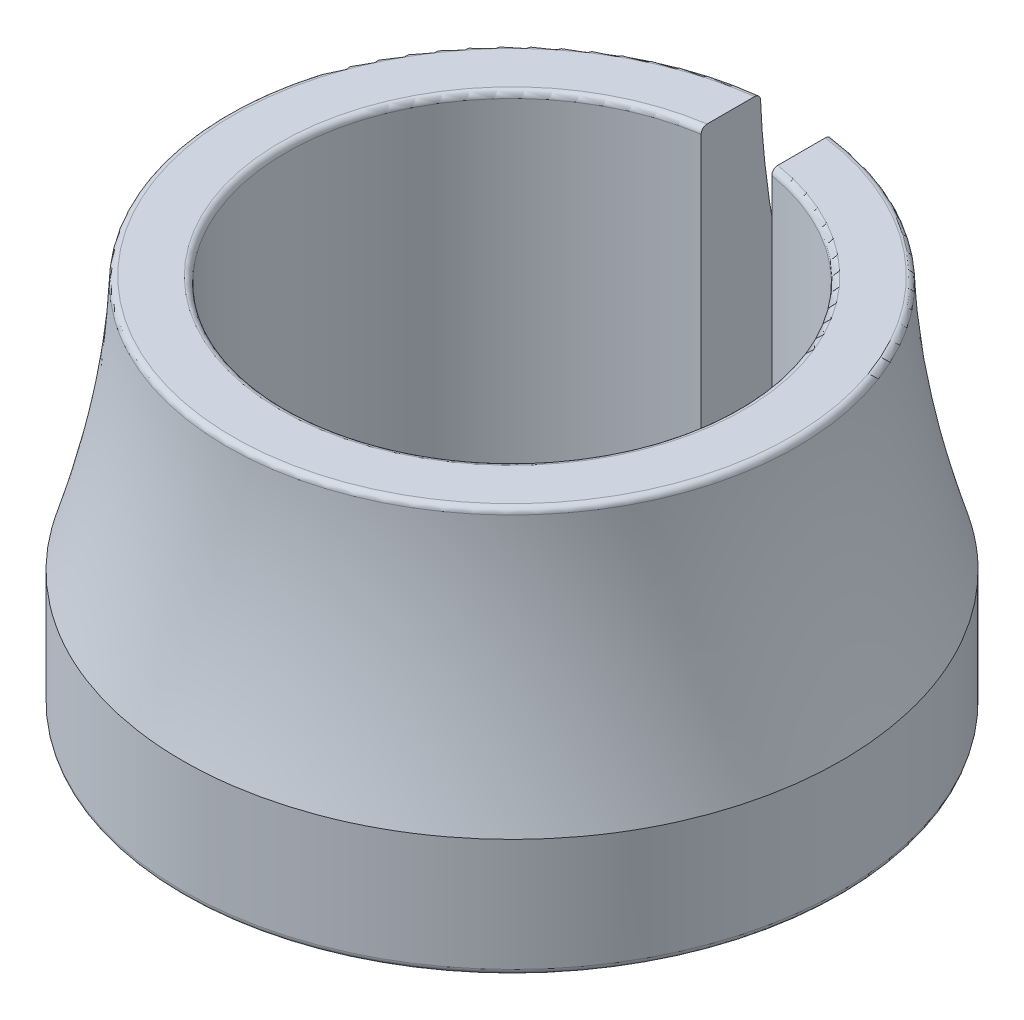
ISO-10303-21;
HEADER;
FILE_DESCRIPTION(('STEP AP214'),'2;1');
FILE_NAME('part.step','',(''),(''),'','','');
FILE_SCHEMA(('AUTOMOTIVE_DESIGN { 1 0 10303 214 1 1 1 1 }'));
ENDSEC;
DATA;
#1=APPLICATION_CONTEXT('core data for automotive mechanical design processes');
#2=APPLICATION_PROTOCOL_DEFINITION('international standard','automotive_design',2000,#1);
#3=PRODUCT_CONTEXT('',#1,'mechanical');
#4=PRODUCT('Part','Part','',(#3));
#5=PRODUCT_RELATED_PRODUCT_CATEGORY('part','',(#4));
#6=PRODUCT_DEFINITION_FORMATION('','',#4);
#7=PRODUCT_DEFINITION_CONTEXT('part definition',#1,'design');
#8=PRODUCT_DEFINITION('design','',#6,#7);
#9=PRODUCT_DEFINITION_SHAPE('','',#8);
#10=(LENGTH_UNIT() NAMED_UNIT(*) SI_UNIT(.MILLI.,.METRE.));
#11=(NAMED_UNIT(*) PLANE_ANGLE_UNIT() SI_UNIT($,.RADIAN.));
#12=(NAMED_UNIT(*) SI_UNIT($,.STERADIAN.) SOLID_ANGLE_UNIT());
#13=UNCERTAINTY_MEASURE_WITH_UNIT(LENGTH_MEASURE(1.E-05),#10,'distance_accuracy_value','');
#14=(GEOMETRIC_REPRESENTATION_CONTEXT(3) GLOBAL_UNCERTAINTY_ASSIGNED_CONTEXT((#13)) GLOBAL_UNIT_ASSIGNED_CONTEXT((#10,
#11,#12)) REPRESENTATION_CONTEXT('',''));
#15=CARTESIAN_POINT('',(0.,0.,0.));
#16=DIRECTION('',(0.,0.,1.));
#17=DIRECTION('',(1.,0.,0.));
#18=AXIS2_PLACEMENT_3D('',#15,#16,#17);
#19=CARTESIAN_POINT('',(0.,0.,0.));
#20=DIRECTION('',(0.,1.,0.));
#21=DIRECTION('',(0.,0.,1.));
#22=AXIS2_PLACEMENT_3D('',#19,#20,#21);
#23=PLANE('',#22);
#24=DIRECTION('',(0.,0.,1.));
#25=VECTOR('',#24,1.);
#26=CARTESIAN_POINT('',(-0.576429737181854,0.,0.));
#27=LINE('',#26,#25);
#28=CARTESIAN_POINT('',(-0.576429737181854,0.,-5.42948697006379));
#29=VERTEX_POINT('',#28);
#30=CARTESIAN_POINT('',(-0.576429737181854,0.,-3.86727665910941));
#31=VERTEX_POINT('',#30);
#32=EDGE_CURVE('E149',#29,#31,#27,.T.);
#33=ORIENTED_EDGE('',*,*,#32,.T.);
#34=CARTESIAN_POINT('',(0.,0.,0.));
#35=DIRECTION('',(0.,1.,0.));
#36=DIRECTION('',(0.,0.,1.));
#37=AXIS2_PLACEMENT_3D('',#34,#35,#36);
#38=CIRCLE('',#37,3.91);
#39=CARTESIAN_POINT('',(0.623570262818146,0.,-3.85995597479154));
#40=VERTEX_POINT('',#39);
#41=EDGE_CURVE('E250',#31,#40,#38,.T.);
#42=ORIENTED_EDGE('',*,*,#41,.T.);
#43=DIRECTION('',(0.,0.,-1.));
#44=VECTOR('',#43,1.);
#45=CARTESIAN_POINT('',(0.623570262818147,0.,0.));
#46=LINE('',#45,#44);
#47=CARTESIAN_POINT('',(0.623570262818146,0.,-5.42427507850855));
#48=VERTEX_POINT('',#47);
#49=EDGE_CURVE('E128',#40,#48,#46,.T.);
#50=ORIENTED_EDGE('',*,*,#49,.T.);
#51=CARTESIAN_POINT('',(0.,0.,0.));
#52=DIRECTION('',(0.,1.,0.));
#53=DIRECTION('',(0.,0.,1.));
#54=AXIS2_PLACEMENT_3D('',#51,#52,#53);
#55=CIRCLE('',#54,5.46);
#56=EDGE_CURVE('E272',#48,#29,#55,.F.);
#57=ORIENTED_EDGE('',*,*,#56,.T.);
#58=EDGE_LOOP('',(#33,#42,#50,#57));
#59=FACE_BOUND('',#58,.T.);
#60=ADVANCED_FACE('F43',(#59),#23,.F.);
#61=CARTESIAN_POINT('',(0.,2.,0.));
#62=DIRECTION('',(0.,-1.,0.));
#63=DIRECTION('',(0.,0.,-1.));
#64=AXIS2_PLACEMENT_3D('',#61,#62,#63);
#65=CYLINDRICAL_SURFACE('',#64,5.56);
#66=DIRECTION('',(0.,-1.,0.));
#67=VECTOR('',#66,1.);
#68=CARTESIAN_POINT('',(-0.576429737181854,2.,-5.53003876641859));
#69=LINE('',#68,#67);
#70=CARTESIAN_POINT('',(-0.576429737181854,2.,-5.53003876641859));
#71=VERTEX_POINT('',#70);
#72=CARTESIAN_POINT('',(-0.576429737181854,0.1,-5.53003876641859));
#73=VERTEX_POINT('',#72);
#74=EDGE_CURVE('E262',#71,#73,#69,.T.);
#75=ORIENTED_EDGE('',*,*,#74,.T.);
#76=CARTESIAN_POINT('',(0.,0.1,0.));
#77=DIRECTION('',(0.,1.,0.));
#78=DIRECTION('',(0.,0.,1.));
#79=AXIS2_PLACEMENT_3D('',#76,#77,#78);
#80=CIRCLE('',#79,5.56);
#81=CARTESIAN_POINT('',(0.623570262818146,0.1,-5.52492173042559));
#82=VERTEX_POINT('',#81);
#83=EDGE_CURVE('E125',#73,#82,#80,.T.);
#84=ORIENTED_EDGE('',*,*,#83,.T.);
#85=DIRECTION('',(0.,-1.,0.));
#86=VECTOR('',#85,1.);
#87=CARTESIAN_POINT('',(0.623570262818146,2.,-5.52492173042559));
#88=LINE('',#87,#86);
#89=CARTESIAN_POINT('',(0.623570262818146,2.,-5.52492173042559));
#90=VERTEX_POINT('',#89);
#91=EDGE_CURVE('E118',#82,#90,#88,.F.);
#92=ORIENTED_EDGE('',*,*,#91,.T.);
#93=CARTESIAN_POINT('',(0.,2.,0.));
#94=DIRECTION('',(0.,-1.,0.));
#95=DIRECTION('',(0.,0.,-1.));
#96=AXIS2_PLACEMENT_3D('',#93,#94,#95);
#97=CIRCLE('',#96,5.56);
#98=EDGE_CURVE('E123',#71,#90,#97,.F.);
#99=ORIENTED_EDGE('',*,*,#98,.F.);
#100=EDGE_LOOP('',(#75,#84,#92,#99));
#101=FACE_BOUND('',#100,.T.);
#102=ADVANCED_FACE('F121',(#101),#65,.T.);
#103=CARTESIAN_POINT('',(0.,2.,0.));
#104=DIRECTION('',(0.,-1.,0.));
#105=DIRECTION('',(0.,0.,-1.));
#106=AXIS2_PLACEMENT_3D('',#103,#104,#105);
#107=CYLINDRICAL_SURFACE('',#106,3.81);
#108=DIRECTION('',(0.,-1.,0.));
#109=VECTOR('',#108,1.);
#110=CARTESIAN_POINT('',(0.623570262818146,2.,-3.75862476543335));
#111=LINE('',#110,#109);
#112=CARTESIAN_POINT('',(0.623570262818146,0.1,-3.75862476543335));
#113=VERTEX_POINT('',#112);
#114=CARTESIAN_POINT('',(0.623570262818146,6.2,-3.75862476543335));
#115=VERTEX_POINT('',#114);
#116=EDGE_CURVE('E259',#113,#115,#111,.F.);
#117=ORIENTED_EDGE('',*,*,#116,.F.);
#118=CARTESIAN_POINT('',(0.,0.1,0.));
#119=DIRECTION('',(0.,1.,0.));
#120=DIRECTION('',(0.,0.,1.));
#121=AXIS2_PLACEMENT_3D('',#118,#119,#120);
#122=CIRCLE('',#121,3.81);
#123=CARTESIAN_POINT('',(-0.576429737181854,0.1,-3.76614242403185));
#124=VERTEX_POINT('',#123);
#125=EDGE_CURVE('E289',#113,#124,#122,.F.);
#126=ORIENTED_EDGE('',*,*,#125,.T.);
#127=DIRECTION('',(0.,-1.,0.));
#128=VECTOR('',#127,1.);
#129=CARTESIAN_POINT('',(-0.576429737181854,2.,-3.76614242403185));
#130=LINE('',#129,#128);
#131=CARTESIAN_POINT('',(-0.576429737181854,6.2,-3.76614242403185));
#132=VERTEX_POINT('',#131);
#133=EDGE_CURVE('E145',#132,#124,#130,.T.);
#134=ORIENTED_EDGE('',*,*,#133,.F.);
#135=CARTESIAN_POINT('',(0.,6.2,0.));
#136=DIRECTION('',(0.,1.,0.));
#137=DIRECTION('',(0.,0.,1.));
#138=AXIS2_PLACEMENT_3D('',#135,#136,#137);
#139=CIRCLE('',#138,3.81);
#140=EDGE_CURVE('E293',#132,#115,#139,.T.);
#141=ORIENTED_EDGE('',*,*,#140,.T.);
#142=EDGE_LOOP('',(#117,#126,#134,#141));
#143=FACE_BOUND('',#142,.T.);
#144=ADVANCED_FACE('F305',(#143),#107,.F.);
#145=CARTESIAN_POINT('',(0.,6.3,0.));
#146=DIRECTION('',(0.,1.,0.));
#147=DIRECTION('',(0.,0.,1.));
#148=AXIS2_PLACEMENT_3D('',#145,#146,#147);
#149=PLANE('',#148);
#150=DIRECTION('',(0.,0.,1.));
#151=VECTOR('',#150,1.);
#152=CARTESIAN_POINT('',(-0.576429737181854,6.3,-6.01133868775365));
#153=LINE('',#152,#151);
#154=CARTESIAN_POINT('',(-0.576429737181854,6.3,-4.66815093062153));
#155=VERTEX_POINT('',#154);
#156=CARTESIAN_POINT('',(-0.576429737181854,6.3,-3.86727665910941));
#157=VERTEX_POINT('',#156);
#158=EDGE_CURVE('E241',#155,#157,#153,.T.);
#159=ORIENTED_EDGE('',*,*,#158,.F.);
#160=CARTESIAN_POINT('',(0.,6.3,0.));
#161=DIRECTION('',(0.,1.,0.));
#162=DIRECTION('',(0.,0.,1.));
#163=AXIS2_PLACEMENT_3D('',#160,#161,#162);
#164=CIRCLE('',#163,4.70360546314954);
#165=CARTESIAN_POINT('',(0.623570262818146,6.3,-4.66208799576961));
#166=VERTEX_POINT('',#165);
#167=EDGE_CURVE('E53',#155,#166,#164,.T.);
#168=ORIENTED_EDGE('',*,*,#167,.T.);
#169=DIRECTION('',(0.,0.,-1.));
#170=VECTOR('',#169,1.);
#171=CARTESIAN_POINT('',(0.623570262818146,6.3,-6.01133868775365));
#172=LINE('',#171,#170);
#173=CARTESIAN_POINT('',(0.623570262818146,6.3,-3.85995597479154));
#174=VERTEX_POINT('',#173);
#175=EDGE_CURVE('E129',#174,#166,#172,.T.);
#176=ORIENTED_EDGE('',*,*,#175,.F.);
#177=CARTESIAN_POINT('',(0.,6.3,0.));
#178=DIRECTION('',(0.,1.,0.));
#179=DIRECTION('',(0.,0.,1.));
#180=AXIS2_PLACEMENT_3D('',#177,#178,#179);
#181=CIRCLE('',#180,3.91);
#182=EDGE_CURVE('E60',#174,#157,#181,.F.);
#183=ORIENTED_EDGE('',*,*,#182,.T.);
#184=EDGE_LOOP('',(#159,#168,#176,#183));
#185=FACE_BOUND('',#184,.T.);
#186=ADVANCED_FACE('F240',(#185),#149,.T.);
#187=CARTESIAN_POINT('',(-1.37594728698393,2.,5.38705569522365));
#188=CARTESIAN_POINT('',(-3.1855926788758,6.3,3.59054303473624));
#189=CARTESIAN_POINT('',(9.39816410346337,2.,8.1389502691915));
#190=CARTESIAN_POINT('',(3.99549339059667,6.3,9.96172839248783));
#191=CARTESIAN_POINT('',(12.1500586774312,2.,-2.6351611212558));
#192=CARTESIAN_POINT('',(10.3666787483483,6.3,2.78064232301536));
#193=CARTESIAN_POINT('',(1.37594728698393,2.,-5.38705569522365));
#194=CARTESIAN_POINT('',(3.1855926788758,6.3,-3.59054303473624));
#195=CARTESIAN_POINT('',(-9.39816410346337,2.,-8.1389502691915));
#196=CARTESIAN_POINT('',(-3.99549339059668,6.3,-9.96172839248783));
#197=CARTESIAN_POINT('',(-12.1500586774312,2.,2.6351611212558));
#198=CARTESIAN_POINT('',(-10.3666787483483,6.3,-2.78064232301536));
#199=CARTESIAN_POINT('',(-1.37594728698393,2.,5.38705569522365));
#200=CARTESIAN_POINT('',(-3.1855926788758,6.3,3.59054303473624));
#201=(BOUNDED_SURFACE() B_SPLINE_SURFACE(3,1,((#187,#188),(#189,#190),(#191,#192),(#193,#194),
(#195,#196),(#197,#198),(#199,#200)),.UNSPECIFIED.,.T.,.F.,.F.) B_SPLINE_SURFACE_WITH_KNOTS((4,
3,4),(2,2),(0.,0.5,1.),(0.,1.),
.UNSPECIFIED.) GEOMETRIC_REPRESENTATION_ITEM() RATIONAL_B_SPLINE_SURFACE(((1.,1.),
(0.333333333333333,0.333333333333333),(0.333333333333333,0.333333333333333),(1.,1.),
(0.333333333333333,0.333333333333333),(0.333333333333333,0.333333333333333),(1.,1.))) REPRESENTATION_ITEM('') SURFACE());
#202=CARTESIAN_POINT('',(0.623570262818146,6.29999999999999,-4.75932349471318));
#203=CARTESIAN_POINT('',(0.623570262818146,6.09968168813343,-4.76600216771926));
#204=CARTESIAN_POINT('',(0.623570262818146,5.89953121696423,-4.77717363737652));
#205=CARTESIAN_POINT('',(0.623570262818146,5.50000896444974,-4.80808116869133));
#206=CARTESIAN_POINT('',(0.623570262818146,5.30063679261577,-4.82781216173842));
#207=CARTESIAN_POINT('',(0.623570262818146,4.90289737078828,-4.87542411124673));
#208=CARTESIAN_POINT('',(0.623570262818146,4.70453001734545,-4.90330421063855));
#209=CARTESIAN_POINT('',(0.623570262818146,4.30894409872123,-4.96663690667766));
#210=CARTESIAN_POINT('',(0.623570262818145,4.11172596581643,-5.00209218487051));
#211=CARTESIAN_POINT('',(0.623570262818145,3.59201603851632,-5.10499206706463));
#212=CARTESIAN_POINT('',(0.623570262818146,3.27069350519542,-5.17832768583463));
#213=CARTESIAN_POINT('',(0.623570262818146,2.63221303863086,-5.34064282188769));
#214=CARTESIAN_POINT('',(0.623570262818146,2.31505263834509,-5.42961257621665));
#215=CARTESIAN_POINT('',(0.623570262818145,2.,-5.52492173042559));
#216=B_SPLINE_CURVE_WITH_KNOTS('',3,(#202,#203,#204,#205,#206,#207,#208,#209,#210,#211,#212,
#213,#214,#215),.UNSPECIFIED.,.F.,.F.,(4,2,2,2,2,2,4),(0.,0.601212381859438,1.20206923450843,
1.80286291571164,2.40386962592294,3.39216744103037,4.37985027883775),.UNSPECIFIED.);
#217=CARTESIAN_POINT('',(0.623570262818147,6.20401899647207,-4.76287826545647));
#218=VERTEX_POINT('',#217);
#219=EDGE_CURVE('E132',#218,#90,#216,.T.);
#220=CARTESIAN_POINT('',(0.,6.20401899647207,0.));
#221=DIRECTION('',(0.,1.,0.));
#222=DIRECTION('',(0.,0.,1.));
#223=AXIS2_PLACEMENT_3D('',#220,#221,#222);
#224=CIRCLE('',#223,4.80352466884773);
#225=CARTESIAN_POINT('',(-0.576429737181853,6.20401899647207,-4.76881306011477));
#226=VERTEX_POINT('',#225);
#227=EDGE_CURVE('E12',#218,#226,#224,.F.);
#228=CARTESIAN_POINT('',(-0.576429737181854,2.,-5.53003876641859));
#229=CARTESIAN_POINT('',(-0.576429737181842,2.19810849777611,-5.47016071799676));
#230=CARTESIAN_POINT('',(-0.576429737181847,2.39700209533741,-5.41280417379019));
#231=CARTESIAN_POINT('',(-0.576429737181861,2.79644954414181,-5.30382969985873));
#232=CARTESIAN_POINT('',(-0.57642973718187,2.99700411324854,-5.25221440727013));
#233=CARTESIAN_POINT('',(-0.576429737181865,3.39971540504871,-5.15546619378763));
#234=CARTESIAN_POINT('',(-0.576429737181851,3.60187238569632,-5.11033433990858));
#235=CARTESIAN_POINT('',(-0.576429737181856,4.00762878154119,-5.02732877820046));
#236=CARTESIAN_POINT('',(-0.576429737181875,4.21122781788989,-4.9894532323935));
#237=CARTESIAN_POINT('',(-0.576429737181871,4.57120702840901,-4.92972926903152));
#238=CARTESIAN_POINT('',(-0.576429737181858,4.7273109162333,-4.90621108476877));
#239=CARTESIAN_POINT('',(-0.576429737181849,5.04018612788868,-4.86410046886745));
#240=CARTESIAN_POINT('',(-0.576429737181854,5.19695745404083,-4.84550805437284));
#241=CARTESIAN_POINT('',(-0.576429737181854,5.51123349568028,-4.81348496647874));
#242=CARTESIAN_POINT('',(-0.576429737181849,5.66873889666505,-4.80006098755172));
#243=CARTESIAN_POINT('',(-0.576429737181858,5.98412985017644,-4.77858626175429));
#244=CARTESIAN_POINT('',(-0.576429737181873,6.14201543781725,-4.77053603193217));
#245=CARTESIAN_POINT('',(-0.576429737181911,6.3,-4.76526271658682));
#246=B_SPLINE_CURVE_WITH_KNOTS('',3,(#228,#229,#230,#231,#232,#233,#234,#235,#236,#237,#238,
#239,#240,#241,#242,#243,#244,#245),.UNSPECIFIED.,.F.,.F.,(4,2,2,2,2,2,2,2,4),(0.,
0.620895568561476,1.24207516629552,1.86335687810961,2.48448101445294,2.9580065354184,
3.43153370445015,3.90567216770639,4.37985624476958),.UNSPECIFIED.);
#247=EDGE_CURVE('E140',#71,#226,#246,.T.);
#248=ORIENTED_EDGE('',*,*,#219,.F.);
#249=ORIENTED_EDGE('',*,*,#227,.T.);
#250=ORIENTED_EDGE('',*,*,#247,.F.);
#251=ORIENTED_EDGE('',*,*,#98,.T.);
#252=EDGE_LOOP('',(#248,#249,#250,#251));
#253=FACE_BOUND('',#252,.T.);
#254=ADVANCED_FACE('F143',(#253),#201,.T.);
#255=CARTESIAN_POINT('',(0.623570262818146,-0.7,-6.01133868775365));
#256=DIRECTION('',(1.,0.,0.));
#257=DIRECTION('',(0.,0.,-1.));
#258=AXIS2_PLACEMENT_3D('',#255,#256,#257);
#259=PLANE('',#258);
#260=ORIENTED_EDGE('',*,*,#49,.F.);
#261=CARTESIAN_POINT('',(0.623570262818146,0.,-3.85995597479154));
#262=CARTESIAN_POINT('',(0.623570262818146,-4.51339665573022E-06,-3.85420057377446));
#263=CARTESIAN_POINT('',(0.623570262818146,0.000483975262759621,-3.84844622855071));
#264=CARTESIAN_POINT('',(0.623570262818146,0.00241378192575914,-3.83710191145305));
#265=CARTESIAN_POINT('',(0.623570262818146,0.00385470215903917,-3.83151187197655));
#266=CARTESIAN_POINT('',(0.623570262818146,0.00765737757972374,-3.82065013138815));
#267=CARTESIAN_POINT('',(0.623570262818146,0.0100196793433935,-3.81537862138004));
#268=CARTESIAN_POINT('',(0.623570262818146,0.015599795856445,-3.80531131449274));
#269=CARTESIAN_POINT('',(0.623570262818146,0.0188173750907038,-3.80051538715225));
#270=CARTESIAN_POINT('',(0.623570262818146,0.026000273257931,-3.79156514528295));
#271=CARTESIAN_POINT('',(0.623570262818146,0.0299612516544554,-3.78740734893221));
#272=CARTESIAN_POINT('',(0.623570262818146,0.0385339370031418,-3.77982509420399));
#273=CARTESIAN_POINT('',(0.623570262818146,0.0431457517078769,-3.77640075749505));
#274=CARTESIAN_POINT('',(0.623570262818146,0.0528271709272561,-3.77042933681842));
#275=CARTESIAN_POINT('',(0.623570262818146,0.0578904503992174,-3.76787198555997));
#276=CARTESIAN_POINT('',(0.623570262818146,0.0683767753692404,-3.76365718374756));
#277=CARTESIAN_POINT('',(0.623570262818146,0.0737995365755504,-3.76199903138015));
#278=CARTESIAN_POINT('',(0.623570262818146,0.0827185628339694,-3.76008764465664));
#279=CARTESIAN_POINT('',(0.623570262818146,0.086154337669907,-3.75953938851844));
#280=CARTESIAN_POINT('',(0.623570262818146,0.0930595476971011,-3.75880803365963));
#281=CARTESIAN_POINT('',(0.623570262818146,0.0965289276754918,-3.75862441344412));
#282=CARTESIAN_POINT('',(0.623570262818146,0.0999999999999504,-3.75862476543312));
#283=B_SPLINE_CURVE_WITH_KNOTS('',3,(#261,#262,#263,#264,#265,#266,#267,#268,#269,#270,#271,
#272,#273,#274,#275,#276,#277,#278,#279,#280,#281,#282),.UNSPECIFIED.,.F.,.F.,(4,2,2,2,2,2,2,2,
2,2,4),(0.,0.0172440822160412,0.0344809672183447,0.0517280929690646,0.0689704743430361,
0.0861151483445208,0.103262664158492,0.120199370398906,0.137122838657489,0.147542813474109,
0.157947875090332),.UNSPECIFIED.);
#284=EDGE_CURVE('E196',#40,#113,#283,.T.);
#285=ORIENTED_EDGE('',*,*,#284,.T.);
#286=ORIENTED_EDGE('',*,*,#116,.T.);
#287=CARTESIAN_POINT('',(0.623570262818146,6.2,-3.75862476543335));
#288=CARTESIAN_POINT('',(0.623570262818146,6.20557137650134,-3.75861966396657));
#289=CARTESIAN_POINT('',(0.623570262818146,6.21114086456128,-3.75909641514337));
#290=CARTESIAN_POINT('',(0.623570262818146,6.22211502780659,-3.76097542316331));
#291=CARTESIAN_POINT('',(0.623570262818146,6.22751988871704,-3.76237659334886));
#292=CARTESIAN_POINT('',(0.623570262818146,6.23801937370538,-3.76606704000874));
#293=CARTESIAN_POINT('',(0.623570262818146,6.24311389002617,-3.76835662294486));
#294=CARTESIAN_POINT('',(0.623570262818146,6.25284898549476,-3.77375304169761));
#295=CARTESIAN_POINT('',(0.623570262818146,6.25748959454056,-3.7768598236371));
#296=CARTESIAN_POINT('',(0.623570262818146,6.26621732323492,-3.78382052701552));
#297=CARTESIAN_POINT('',(0.623570262818146,6.27030096289522,-3.78767881011191));
#298=CARTESIAN_POINT('',(0.623570262818146,6.27777316325496,-3.79601926389928));
#299=CARTESIAN_POINT('',(0.623570262818146,6.2811615709615,-3.80050157154974));
#300=CARTESIAN_POINT('',(0.623570262818146,6.28719247284688,-3.81002338155499));
#301=CARTESIAN_POINT('',(0.623570262818146,6.2898248114728,-3.81506930960028));
#302=CARTESIAN_POINT('',(0.623570262818146,6.29421509097316,-3.82552721158115));
#303=CARTESIAN_POINT('',(0.623570262818146,6.29597338795679,-3.83093903541783));
#304=CARTESIAN_POINT('',(0.623570262818146,6.2981785826916,-3.84030603823016));
#305=CARTESIAN_POINT('',(0.623570262818146,6.29886117128031,-3.84420745682777));
#306=CARTESIAN_POINT('',(0.623570262818146,6.29977185963666,-3.85205742227137));
#307=CARTESIAN_POINT('',(0.623570262818146,6.30000059582831,-3.85600589530146));
#308=CARTESIAN_POINT('',(0.623570262818146,6.30000000000088,-3.85995597479133));
#309=B_SPLINE_CURVE_WITH_KNOTS('',3,(#287,#288,#289,#290,#291,#292,#293,#294,#295,#296,#297,
#298,#299,#300,#301,#302,#303,#304,#305,#306,#307,#308),.UNSPECIFIED.,.F.,.F.,(4,2,2,2,2,2,2,2,
2,2,4),(0.,0.016690974813961,0.0333623642071331,0.0500395095873779,0.0667155557347821,
0.083491438864067,0.100271009747734,0.117266420928921,0.134254902013925,0.146112044941932,
0.157952549159574),.UNSPECIFIED.);
#310=EDGE_CURVE('E178',#115,#174,#309,.T.);
#311=ORIENTED_EDGE('',*,*,#310,.T.);
#312=ORIENTED_EDGE('',*,*,#175,.T.);
#313=CARTESIAN_POINT('',(0.623570262818146,6.3,-4.66208799576961));
#314=CARTESIAN_POINT('',(0.623570262818146,6.30000461608416,-4.66779936343146));
#315=CARTESIAN_POINT('',(0.623570262818146,6.2995195705084,-4.67350962235546));
#316=CARTESIAN_POINT('',(0.623570262818146,6.29760361643918,-4.68476641826885));
#317=CARTESIAN_POINT('',(0.623570262818146,6.29617318047909,-4.69031303560492));
#318=CARTESIAN_POINT('',(0.623570262818146,6.2923987540787,-4.70109017949518));
#319=CARTESIAN_POINT('',(0.623570262818146,6.29005423609199,-4.70632052149946));
#320=CARTESIAN_POINT('',(0.623570262818146,6.28451768696269,-4.71630981928237));
#321=CARTESIAN_POINT('',(0.623570262818146,6.28132589213317,-4.72106890599092));
#322=CARTESIAN_POINT('',(0.623570262818146,6.2741976011736,-4.72995948295612));
#323=CARTESIAN_POINT('',(0.623570262818146,6.27026428227721,-4.73409351997633));
#324=CARTESIAN_POINT('',(0.623570262818146,6.26175287105584,-4.74163713341035));
#325=CARTESIAN_POINT('',(0.623570262818146,6.25717460638651,-4.74504651556675));
#326=CARTESIAN_POINT('',(0.623570262818146,6.24754412071715,-4.75101317192291));
#327=CARTESIAN_POINT('',(0.623570262818146,6.24249595288876,-4.75357699885871));
#328=CARTESIAN_POINT('',(0.623570262818146,6.23204068287539,-4.75781108608411));
#329=CARTESIAN_POINT('',(0.623570262818146,6.22663395434483,-4.75948226065143));
#330=CARTESIAN_POINT('',(0.623570262818146,6.21831402853738,-4.76129672226651));
#331=CARTESIAN_POINT('',(0.623570262818146,6.21547251882261,-4.76178760280913));
#332=CARTESIAN_POINT('',(0.623570262818146,6.20976246428784,-4.76251985511907));
#333=CARTESIAN_POINT('',(0.623570262818146,6.20689397394007,-4.76276165166144));
#334=CARTESIAN_POINT('',(0.623570262818146,6.20401899647208,-4.76287826545649));
#335=B_SPLINE_CURVE_WITH_KNOTS('',3,(#313,#314,#315,#316,#317,#318,#319,#320,#321,#322,#323,
#324,#325,#326,#327,#328,#329,#330,#331,#332,#333,#334),.UNSPECIFIED.,.F.,.F.,(4,2,2,2,2,2,2,2,
2,2,4),(0.,0.0171120128020018,0.0342154789883865,0.0513288307869395,0.068437414524762,
0.085474293343032,0.102515733473761,0.119421823168716,0.136310563842721,0.144951833496734,
0.153578342255181),.UNSPECIFIED.);
#336=EDGE_CURVE('E136',#166,#218,#335,.T.);
#337=ORIENTED_EDGE('',*,*,#336,.T.);
#338=ORIENTED_EDGE('',*,*,#219,.T.);
#339=ORIENTED_EDGE('',*,*,#91,.F.);
#340=CARTESIAN_POINT('',(0.623570262818146,0.1,-5.52492173042559));
#341=CARTESIAN_POINT('',(0.623570262818146,0.0944000114115534,-5.5249266546626));
#342=CARTESIAN_POINT('',(0.623570262818146,0.0888016578862737,-5.52444864657856));
#343=CARTESIAN_POINT('',(0.623570262818146,0.0777689723583619,-5.52256334954925));
#344=CARTESIAN_POINT('',(0.623570262818146,0.0723344876620619,-5.52115695553609));
#345=CARTESIAN_POINT('',(0.623570262818146,0.0617766979939325,-5.51745056432008));
#346=CARTESIAN_POINT('',(0.623570262818146,0.0566535245545968,-5.51515019239576));
#347=CARTESIAN_POINT('',(0.623570262818146,0.0468652698252841,-5.50972493465881));
#348=CARTESIAN_POINT('',(0.623570262818146,0.0422001307515095,-5.50660015303431));
#349=CARTESIAN_POINT('',(0.623570262818146,0.0334449842433822,-5.49960619447181));
#350=CARTESIAN_POINT('',(0.623570262818146,0.0293565881878442,-5.49573500075204));
#351=CARTESIAN_POINT('',(0.623570262818146,0.0218822636967435,-5.48736400312768));
#352=CARTESIAN_POINT('',(0.623570262818146,0.0184964801833651,-5.48286406985774));
#353=CARTESIAN_POINT('',(0.623570262818146,0.0125022824299239,-5.47333489424477));
#354=CARTESIAN_POINT('',(0.623570262818146,0.00989878932498773,-5.46830255975903));
#355=CARTESIAN_POINT('',(0.623570262818146,0.00556920627104457,-5.4578748255884));
#356=CARTESIAN_POINT('',(0.623570262818146,0.00384268394718477,-5.45247960630616));
#357=CARTESIAN_POINT('',(0.623570262818146,0.00172101616223237,-5.44325843711269));
#358=CARTESIAN_POINT('',(0.623570262818146,0.00107601523757414,-5.43948802296773));
#359=CARTESIAN_POINT('',(0.623570262818146,0.000215546157759894,-5.43190392828474));
#360=CARTESIAN_POINT('',(0.623570262818146,-5.30390430270976E-07,-5.42809031675698));
#361=CARTESIAN_POINT('',(0.623570262818146,-6.41677335915684E-13,-5.42427507850869));
#362=B_SPLINE_CURVE_WITH_KNOTS('',3,(#340,#341,#342,#343,#344,#345,#346,#347,#348,#349,#350,
#351,#352,#353,#354,#355,#356,#357,#358,#359,#360,#361),.UNSPECIFIED.,.F.,.F.,(4,2,2,2,2,2,2,2,
2,2,4),(0.,0.0167772189515826,0.0335382888115412,0.0503063918639654,0.0670723767936032,
0.0838843143133245,0.100699716055773,0.11761878412016,0.134529502422243,0.145982192584092,
0.15741862643062),.UNSPECIFIED.);
#363=EDGE_CURVE('E189',#82,#48,#362,.T.);
#364=ORIENTED_EDGE('',*,*,#363,.T.);
#365=EDGE_LOOP('',(#260,#285,#286,#311,#312,#337,#338,#339,#364));
#366=FACE_BOUND('',#365,.T.);
#367=ADVANCED_FACE('F134',(#366),#259,.F.);
#368=CARTESIAN_POINT('',(-0.576429737181854,-0.7,-6.01133868775365));
#369=DIRECTION('',(-1.,0.,0.));
#370=DIRECTION('',(0.,0.,1.));
#371=AXIS2_PLACEMENT_3D('',#368,#369,#370);
#372=PLANE('',#371);
#373=ORIENTED_EDGE('',*,*,#133,.T.);
#374=CARTESIAN_POINT('',(-0.576429737181854,0.1,-3.76614242403185));
#375=CARTESIAN_POINT('',(-0.576429737181854,0.0944206660339778,-3.76613736944235));
#376=CARTESIAN_POINT('',(-0.576429737181854,0.0888431533533806,-3.76661448273276));
#377=CARTESIAN_POINT('',(-0.576429737181854,0.0778527381818086,-3.76849527260347));
#378=CARTESIAN_POINT('',(-0.576429737181854,0.0724396587870491,-3.76989791365872));
#379=CARTESIAN_POINT('',(-0.576429737181854,0.0619240041322004,-3.77359281465781));
#380=CARTESIAN_POINT('',(-0.576429737181854,0.0568215429406815,-3.77588539916356));
#381=CARTESIAN_POINT('',(-0.576429737181854,0.0470716872923706,-3.78128980261051));
#382=CARTESIAN_POINT('',(-0.576429737181854,0.0424242555834555,-3.78440155441148));
#383=CARTESIAN_POINT('',(-0.576429737181854,0.0336886856898179,-3.79137152362243));
#384=CARTESIAN_POINT('',(-0.576429737181854,0.0296035321074638,-3.79523348040971));
#385=CARTESIAN_POINT('',(-0.576429737181854,0.0221303534518775,-3.80358261671616));
#386=CARTESIAN_POINT('',(-0.576429737181854,0.018742479608712,-3.8080699315134));
#387=CARTESIAN_POINT('',(-0.576429737181854,0.0127213996861996,-3.81759410617195));
#388=CARTESIAN_POINT('',(-0.576429737181854,0.0100969117450232,-3.82263647179313));
#389=CARTESIAN_POINT('',(-0.576429737181854,0.00572330520747683,-3.83308647457645));
#390=CARTESIAN_POINT('',(-0.576429737181854,0.00397380736264315,-3.83849395233191));
#391=CARTESIAN_POINT('',(-0.576429737181854,0.00179245931771118,-3.8478193170379));
#392=CARTESIAN_POINT('',(-0.576429737181854,0.00112071942910557,-3.85168288031107));
#393=CARTESIAN_POINT('',(-0.576429737181854,0.000224514898017982,-3.85945602456403));
#394=CARTESIAN_POINT('',(-0.576429737181854,-5.76998970155302E-07,-3.8633655332419));
#395=CARTESIAN_POINT('',(-0.576429737181854,-8.05804031930208E-13,-3.86727665910922));
#396=B_SPLINE_CURVE_WITH_KNOTS('',3,(#374,#375,#376,#377,#378,#379,#380,#381,#382,#383,#384,
#385,#386,#387,#388,#389,#390,#391,#392,#393,#394,#395),.UNSPECIFIED.,.F.,.F.,(4,2,2,2,2,2,2,2,
2,2,4),(0.,0.0167149542434339,0.0334112386295723,0.0501136178711969,0.066814628585555,
0.0836011261808875,0.100391260701329,0.117366225602671,0.134333826625723,0.146074092158801,
0.157797858432449),.UNSPECIFIED.);
#397=EDGE_CURVE('E222',#124,#31,#396,.T.);
#398=ORIENTED_EDGE('',*,*,#397,.T.);
#399=ORIENTED_EDGE('',*,*,#32,.F.);
#400=CARTESIAN_POINT('',(-0.576429737181854,0.,-5.42948697006379));
#401=CARTESIAN_POINT('',(-0.576429737181854,-4.67553380205666E-06,-5.43516680713298));
#402=CARTESIAN_POINT('',(-0.576429737181854,0.000478241037700413,-5.44084541423108));
#403=CARTESIAN_POINT('',(-0.576429737181854,0.00238510178095536,-5.45203893559999));
#404=CARTESIAN_POINT('',(-0.576429737181854,0.00380846344881033,-5.45755394899136));
#405=CARTESIAN_POINT('',(-0.576429737181854,0.00756314796503297,-5.46826935958619));
#406=CARTESIAN_POINT('',(-0.576429737181854,0.00989496025234791,-5.47346958544613));
#407=CARTESIAN_POINT('',(-0.576429737181854,0.0153999663286549,-5.48340233219319));
#408=CARTESIAN_POINT('',(-0.576429737181854,0.0185729721176833,-5.4881349572613));
#409=CARTESIAN_POINT('',(-0.576429737181854,0.0256629962014669,-5.49698537758712));
#410=CARTESIAN_POINT('',(-0.576429737181854,0.0295780577557363,-5.50110474007602));
#411=CARTESIAN_POINT('',(-0.576429737181854,0.0380483918759535,-5.50862437369153));
#412=CARTESIAN_POINT('',(-0.576429737181854,0.0426037828639493,-5.51202451151327));
#413=CARTESIAN_POINT('',(-0.576429737181854,0.0521996210294585,-5.51798960090584));
#414=CARTESIAN_POINT('',(-0.576429737181854,0.0572375154609047,-5.52055866390314));
#415=CARTESIAN_POINT('',(-0.576429737181854,0.0676734241127535,-5.52480840449431));
#416=CARTESIAN_POINT('',(-0.576429737181854,0.0730711968147739,-5.52648967127202));
#417=CARTESIAN_POINT('',(-0.576429737181854,0.0820874239866079,-5.5284790706753));
#418=CARTESIAN_POINT('',(-0.576429737181854,0.0856472897280499,-5.52906360784962));
#419=CARTESIAN_POINT('',(-0.576429737181854,0.0928042521991955,-5.5298433879212));
#420=CARTESIAN_POINT('',(-0.576429737181854,0.0964012885574484,-5.53003918510015));
#421=CARTESIAN_POINT('',(-0.576429737181854,0.0999999999999193,-5.53003876641896));
#422=B_SPLINE_CURVE_WITH_KNOTS('',3,(#400,#401,#402,#403,#404,#405,#406,#407,#408,#409,#410,
#411,#412,#413,#414,#415,#416,#417,#418,#419,#420,#421),.UNSPECIFIED.,.F.,.F.,(4,2,2,2,2,2,2,2,
2,2,4),(0.,0.0170172924537007,0.0340240544061708,0.0510399916600856,0.0680521291905056,
0.0850200159604529,0.10199104489751,0.118876784431646,0.135751303656623,0.146554265450482,
0.157341812837404),.UNSPECIFIED.);
#423=EDGE_CURVE('E214',#29,#73,#422,.T.);
#424=ORIENTED_EDGE('',*,*,#423,.T.);
#425=ORIENTED_EDGE('',*,*,#74,.F.);
#426=ORIENTED_EDGE('',*,*,#247,.T.);
#427=CARTESIAN_POINT('',(-0.576429737181855,6.20401899647207,-4.76881306011477));
#428=CARTESIAN_POINT('',(-0.576429737181854,6.20961329925938,-4.76859134941533));
#429=CARTESIAN_POINT('',(-0.576429737181854,6.21518633164621,-4.7678869430467));
#430=CARTESIAN_POINT('',(-0.576429737181854,6.22613070028969,-4.76555625185969));
#431=CARTESIAN_POINT('',(-0.576429737181854,6.23150222965982,-4.76393087504831));
#432=CARTESIAN_POINT('',(-0.576429737181854,6.24189813869847,-4.75980032343732));
#433=CARTESIAN_POINT('',(-0.576429737181854,6.24692237822144,-4.75729479591318));
#434=CARTESIAN_POINT('',(-0.576429737181854,6.25648017910324,-4.75147932943486));
#435=CARTESIAN_POINT('',(-0.576429737181854,6.26101380812787,-4.74816950161597));
#436=CARTESIAN_POINT('',(-0.576429737181854,6.26948020160127,-4.74082792534035));
#437=CARTESIAN_POINT('',(-0.576429737181854,6.27341086132807,-4.73679375023834));
#438=CARTESIAN_POINT('',(-0.576429737181854,6.28054585213835,-4.72812556493729));
#439=CARTESIAN_POINT('',(-0.576429737181854,6.28374997098461,-4.72349138008282));
#440=CARTESIAN_POINT('',(-0.576429737181854,6.28936422672385,-4.71372032857608));
#441=CARTESIAN_POINT('',(-0.576429737181854,6.29176840555673,-4.7085800438334));
#442=CARTESIAN_POINT('',(-0.576429737181854,6.29568411683496,-4.69797226625353));
#443=CARTESIAN_POINT('',(-0.576429737181854,6.29719635146811,-4.69250503455202));
#444=CARTESIAN_POINT('',(-0.576429737181854,6.29882794291672,-4.68385363582825));
#445=CARTESIAN_POINT('',(-0.576429737181854,6.29926747137501,-4.68072649070935));
#446=CARTESIAN_POINT('',(-0.576429737181854,6.29985328599262,-4.67445032743692));
#447=CARTESIAN_POINT('',(-0.576429737181854,6.30000007985903,-4.6713013566751));
#448=CARTESIAN_POINT('',(-0.576429737181854,6.30000000000004,-4.66815093062154));
#449=B_SPLINE_CURVE_WITH_KNOTS('',3,(#427,#428,#429,#430,#431,#432,#433,#434,#435,#436,#437,
#438,#439,#440,#441,#442,#443,#444,#445,#446,#447,#448),.UNSPECIFIED.,.F.,.F.,(4,2,2,2,2,2,2,2,
2,2,4),(0.,0.0167731897336026,0.0335298710776897,0.0502932754162241,0.0670543647643588,
0.0838726905068328,0.100695922909585,0.117641789705733,0.134574297910266,0.144035699028274,
0.15348067635233),.UNSPECIFIED.);
#450=EDGE_CURVE('E67',#226,#155,#449,.T.);
#451=ORIENTED_EDGE('',*,*,#450,.T.);
#452=ORIENTED_EDGE('',*,*,#158,.T.);
#453=CARTESIAN_POINT('',(-0.576429737181854,6.3,-3.86727665910941));
#454=CARTESIAN_POINT('',(-0.576429737181854,6.30000455340565,-3.86154058678517));
#455=CARTESIAN_POINT('',(-0.576429737181854,6.29951744995058,-3.85580562608425));
#456=CARTESIAN_POINT('',(-0.576429737181854,6.29759341800022,-3.84449993524432));
#457=CARTESIAN_POINT('',(-0.576429737181854,6.29615693805984,-3.83892912884458));
#458=CARTESIAN_POINT('',(-0.576429737181854,6.29236648978118,-3.82810491333157));
#459=CARTESIAN_POINT('',(-0.576429737181854,6.29001199227259,-3.82285168930237));
#460=CARTESIAN_POINT('',(-0.576429737181854,6.28445117760925,-3.81281884866118));
#461=CARTESIAN_POINT('',(-0.576429737181854,6.28124508236651,-3.80803910911198));
#462=CARTESIAN_POINT('',(-0.576429737181854,6.27408589275386,-3.79911394974279));
#463=CARTESIAN_POINT('',(-0.576429737181854,6.27013646652732,-3.79496558874793));
#464=CARTESIAN_POINT('',(-0.576429737181854,6.26158951937478,-3.78739858471867));
#465=CARTESIAN_POINT('',(-0.576429737181854,6.25699188799443,-3.7839800662998));
#466=CARTESIAN_POINT('',(-0.576429737181854,6.24733175820121,-3.77800958768194));
#467=CARTESIAN_POINT('',(-0.576429737181854,6.24227461696594,-3.77544894916656));
#468=CARTESIAN_POINT('',(-0.576429737181854,6.23180040547824,-3.77122476657308));
#469=CARTESIAN_POINT('',(-0.576429737181854,6.22638360895291,-3.76956054884041));
#470=CARTESIAN_POINT('',(-0.576429737181854,6.21743982920174,-3.76762945803284));
#471=CARTESIAN_POINT('',(-0.576429737181854,6.21397290612735,-3.76707215132063));
#472=CARTESIAN_POINT('',(-0.576429737181854,6.20700451446731,-3.76632871447742));
#473=CARTESIAN_POINT('',(-0.576429737181854,6.2035031023352,-3.76614205500326));
#474=CARTESIAN_POINT('',(-0.576429737181854,6.20000000000006,-3.76614242403159));
#475=B_SPLINE_CURVE_WITH_KNOTS('',3,(#453,#454,#455,#456,#457,#458,#459,#460,#461,#462,#463,
#464,#465,#466,#467,#468,#469,#470,#471,#472,#473,#474),.UNSPECIFIED.,.F.,.F.,(4,2,2,2,2,2,2,2,
2,2,4),(0.,0.0171860511753323,0.0343639882021478,0.051551841733179,0.0687352207858781,
0.0858359278805058,0.102939552470419,0.119864528208974,0.136776767126758,0.147292837506357,
0.157793878433525),.UNSPECIFIED.);
#476=EDGE_CURVE('E287',#157,#132,#475,.T.);
#477=ORIENTED_EDGE('',*,*,#476,.T.);
#478=EDGE_LOOP('',(#373,#398,#399,#424,#425,#426,#451,#452,#477));
#479=FACE_BOUND('',#478,.T.);
#480=ADVANCED_FACE('F170',(#479),#372,.F.);
#481=CARTESIAN_POINT('',(0.,0.1,0.));
#482=DIRECTION('',(0.,1.,0.));
#483=DIRECTION('',(0.,0.,1.));
#484=AXIS2_PLACEMENT_3D('',#481,#482,#483);
#485=TOROIDAL_SURFACE('',#484,3.91,0.1);
#486=ORIENTED_EDGE('',*,*,#397,.F.);
#487=ORIENTED_EDGE('',*,*,#125,.F.);
#488=ORIENTED_EDGE('',*,*,#284,.F.);
#489=ORIENTED_EDGE('',*,*,#41,.F.);
#490=EDGE_LOOP('',(#486,#487,#488,#489));
#491=FACE_BOUND('',#490,.T.);
#492=ADVANCED_FACE('F207',(#491),#485,.T.);
#493=CARTESIAN_POINT('',(0.,0.1,0.));
#494=DIRECTION('',(0.,1.,0.));
#495=DIRECTION('',(0.,0.,1.));
#496=AXIS2_PLACEMENT_3D('',#493,#494,#495);
#497=TOROIDAL_SURFACE('',#496,5.46,0.1);
#498=ORIENTED_EDGE('',*,*,#423,.F.);
#499=ORIENTED_EDGE('',*,*,#56,.F.);
#500=ORIENTED_EDGE('',*,*,#363,.F.);
#501=ORIENTED_EDGE('',*,*,#83,.F.);
#502=EDGE_LOOP('',(#498,#499,#500,#501));
#503=FACE_BOUND('',#502,.T.);
#504=ADVANCED_FACE('F203',(#503),#497,.T.);
#505=CARTESIAN_POINT('',(0.,6.2,0.));
#506=DIRECTION('',(0.,1.,0.));
#507=DIRECTION('',(0.,0.,1.));
#508=AXIS2_PLACEMENT_3D('',#505,#506,#507);
#509=TOROIDAL_SURFACE('',#508,4.70360546314954,0.1);
#510=ORIENTED_EDGE('',*,*,#450,.F.);
#511=ORIENTED_EDGE('',*,*,#227,.F.);
#512=ORIENTED_EDGE('',*,*,#336,.F.);
#513=ORIENTED_EDGE('',*,*,#167,.F.);
#514=EDGE_LOOP('',(#510,#511,#512,#513));
#515=FACE_BOUND('',#514,.T.);
#516=ADVANCED_FACE('F206',(#515),#509,.T.);
#517=CARTESIAN_POINT('',(0.,6.2,0.));
#518=DIRECTION('',(0.,1.,0.));
#519=DIRECTION('',(0.,0.,1.));
#520=AXIS2_PLACEMENT_3D('',#517,#518,#519);
#521=TOROIDAL_SURFACE('',#520,3.91,0.1);
#522=ORIENTED_EDGE('',*,*,#476,.F.);
#523=ORIENTED_EDGE('',*,*,#182,.F.);
#524=ORIENTED_EDGE('',*,*,#310,.F.);
#525=ORIENTED_EDGE('',*,*,#140,.F.);
#526=EDGE_LOOP('',(#522,#523,#524,#525));
#527=FACE_BOUND('',#526,.T.);
#528=ADVANCED_FACE('F45',(#527),#521,.T.);
#529=CLOSED_SHELL('',(#60,#102,#144,#186,#254,#367,#480,#492,#504,#516,#528));
#530=MANIFOLD_SOLID_BREP('B2',#529);
#531=ADVANCED_BREP_SHAPE_REPRESENTATION('',(#18,#530),#14);
#532=SHAPE_DEFINITION_REPRESENTATION(#9,#531);
ENDSEC;
END-ISO-10303-21;
